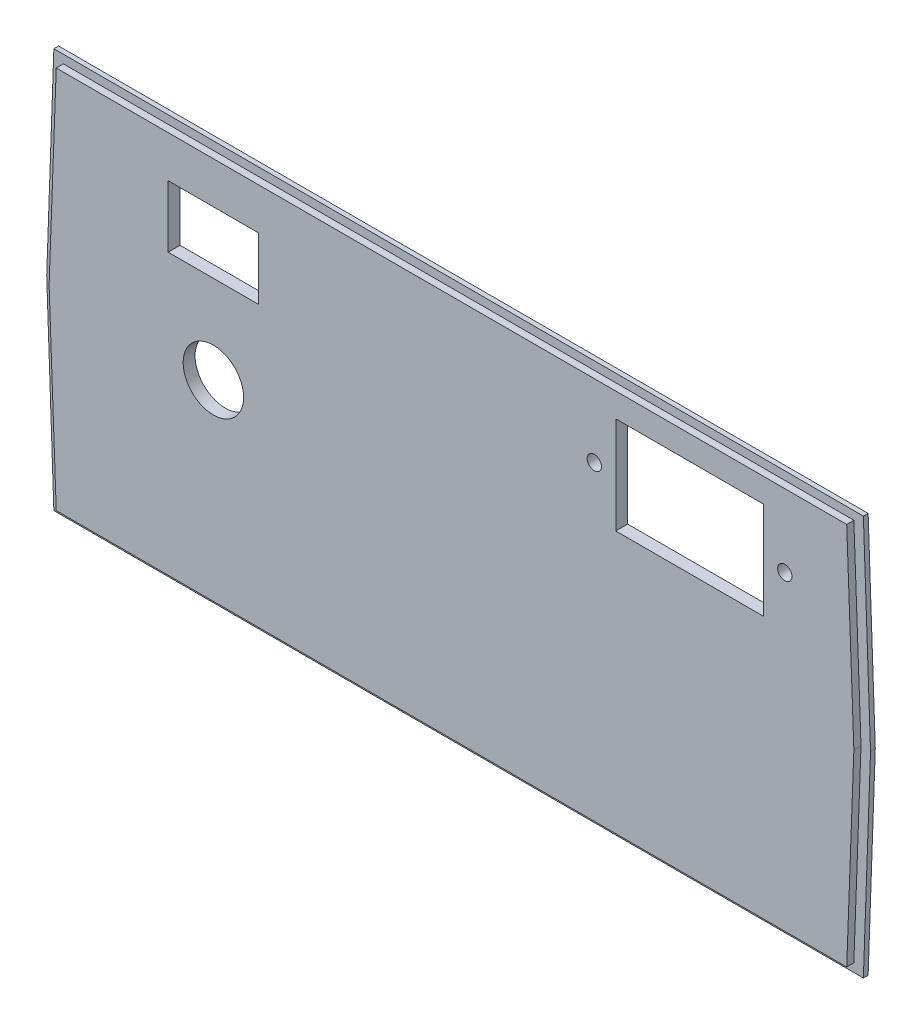
ISO-10303-21;
HEADER;
FILE_DESCRIPTION(('STEP AP214'),'2;1');
FILE_NAME('part.step','',(''),(''),'','','');
FILE_SCHEMA(('AUTOMOTIVE_DESIGN { 1 0 10303 214 1 1 1 1 }'));
ENDSEC;
DATA;
#1=APPLICATION_CONTEXT('core data for automotive mechanical design processes');
#2=APPLICATION_PROTOCOL_DEFINITION('international standard','automotive_design',2000,#1);
#3=PRODUCT_CONTEXT('',#1,'mechanical');
#4=PRODUCT('Part','Part','',(#3));
#5=PRODUCT_RELATED_PRODUCT_CATEGORY('part','',(#4));
#6=PRODUCT_DEFINITION_FORMATION('','',#4);
#7=PRODUCT_DEFINITION_CONTEXT('part definition',#1,'design');
#8=PRODUCT_DEFINITION('design','',#6,#7);
#9=PRODUCT_DEFINITION_SHAPE('','',#8);
#10=(LENGTH_UNIT() NAMED_UNIT(*) SI_UNIT(.MILLI.,.METRE.));
#11=(NAMED_UNIT(*) PLANE_ANGLE_UNIT() SI_UNIT($,.RADIAN.));
#12=(NAMED_UNIT(*) SI_UNIT($,.STERADIAN.) SOLID_ANGLE_UNIT());
#13=UNCERTAINTY_MEASURE_WITH_UNIT(LENGTH_MEASURE(1.E-05),#10,'distance_accuracy_value','');
#14=(GEOMETRIC_REPRESENTATION_CONTEXT(3) GLOBAL_UNCERTAINTY_ASSIGNED_CONTEXT((#13)) GLOBAL_UNIT_ASSIGNED_CONTEXT((#10,
#11,#12)) REPRESENTATION_CONTEXT('',''));
#15=CARTESIAN_POINT('',(0.,0.,0.));
#16=DIRECTION('',(0.,0.,1.));
#17=DIRECTION('',(1.,0.,0.));
#18=AXIS2_PLACEMENT_3D('',#15,#16,#17);
#19=CARTESIAN_POINT('',(0.,0.,1.));
#20=DIRECTION('',(0.,0.,-1.));
#21=DIRECTION('',(-1.,0.,0.));
#22=AXIS2_PLACEMENT_3D('',#19,#20,#21);
#23=PLANE('',#22);
#24=DIRECTION('',(0.0356915305124112,0.99936285434755,0.));
#25=VECTOR('',#24,1.);
#26=CARTESIAN_POINT('',(85.,-42.,1.));
#27=LINE('',#26,#25);
#28=CARTESIAN_POINT('',(85.,-42.,1.));
#29=VERTEX_POINT('',#28);
#30=CARTESIAN_POINT('',(86.5,0.,1.));
#31=VERTEX_POINT('',#30);
#32=EDGE_CURVE('E304',#29,#31,#27,.T.);
#33=ORIENTED_EDGE('',*,*,#32,.T.);
#34=DIRECTION('',(-0.0356915305124112,0.99936285434755,0.));
#35=VECTOR('',#34,1.);
#36=CARTESIAN_POINT('',(85.,42.,1.));
#37=LINE('',#36,#35);
#38=CARTESIAN_POINT('',(85.,42.,1.));
#39=VERTEX_POINT('',#38);
#40=EDGE_CURVE('E307',#31,#39,#37,.T.);
#41=ORIENTED_EDGE('',*,*,#40,.T.);
#42=DIRECTION('',(-1.,0.,0.));
#43=VECTOR('',#42,1.);
#44=CARTESIAN_POINT('',(-85.,42.,1.));
#45=LINE('',#44,#43);
#46=CARTESIAN_POINT('',(-85.,42.,1.));
#47=VERTEX_POINT('',#46);
#48=EDGE_CURVE('E310',#39,#47,#45,.T.);
#49=ORIENTED_EDGE('',*,*,#48,.T.);
#50=DIRECTION('',(-0.0356915305124132,-0.999362854347549,0.));
#51=VECTOR('',#50,1.);
#52=CARTESIAN_POINT('',(-85.,42.,1.));
#53=LINE('',#52,#51);
#54=CARTESIAN_POINT('',(-86.5,0.,1.));
#55=VERTEX_POINT('',#54);
#56=EDGE_CURVE('E312',#47,#55,#53,.T.);
#57=ORIENTED_EDGE('',*,*,#56,.T.);
#58=DIRECTION('',(0.0356915305124132,-0.99936285434755,0.));
#59=VECTOR('',#58,1.);
#60=CARTESIAN_POINT('',(-86.5,0.,1.));
#61=LINE('',#60,#59);
#62=CARTESIAN_POINT('',(-85.,-42.,1.));
#63=VERTEX_POINT('',#62);
#64=EDGE_CURVE('E314',#55,#63,#61,.T.);
#65=ORIENTED_EDGE('',*,*,#64,.T.);
#66=DIRECTION('',(1.,0.,0.));
#67=VECTOR('',#66,1.);
#68=CARTESIAN_POINT('',(-85.,-42.,1.));
#69=LINE('',#68,#67);
#70=EDGE_CURVE('E316',#63,#29,#69,.T.);
#71=ORIENTED_EDGE('',*,*,#70,.T.);
#72=EDGE_LOOP('',(#33,#41,#49,#57,#65,#71));
#73=FACE_BOUND('',#72,.T.);
#74=DIRECTION('',(0.0372412287515797,0.999306304834045,0.));
#75=VECTOR('',#74,1.);
#76=CARTESIAN_POINT('',(83.,-40.25,1.));
#77=LINE('',#76,#75);
#78=CARTESIAN_POINT('',(83.,-40.25,1.));
#79=VERTEX_POINT('',#78);
#80=CARTESIAN_POINT('',(84.5,0.,1.));
#81=VERTEX_POINT('',#80);
#82=EDGE_CURVE('E254',#79,#81,#77,.T.);
#83=ORIENTED_EDGE('',*,*,#82,.F.);
#84=DIRECTION('',(1.,0.,0.));
#85=VECTOR('',#84,1.);
#86=CARTESIAN_POINT('',(-83.,-40.25,1.));
#87=LINE('',#86,#85);
#88=CARTESIAN_POINT('',(-83.,-40.25,1.));
#89=VERTEX_POINT('',#88);
#90=EDGE_CURVE('E259',#89,#79,#87,.T.);
#91=ORIENTED_EDGE('',*,*,#90,.F.);
#92=DIRECTION('',(0.037241228751579,-0.999306304834044,0.));
#93=VECTOR('',#92,1.);
#94=CARTESIAN_POINT('',(-83.,-40.25,1.));
#95=LINE('',#94,#93);
#96=CARTESIAN_POINT('',(-84.5,0.,1.));
#97=VERTEX_POINT('',#96);
#98=EDGE_CURVE('E281',#97,#89,#95,.T.);
#99=ORIENTED_EDGE('',*,*,#98,.F.);
#100=DIRECTION('',(-0.037241228751579,-0.999306304834044,0.));
#101=VECTOR('',#100,1.);
#102=CARTESIAN_POINT('',(-84.5,0.,1.));
#103=LINE('',#102,#101);
#104=CARTESIAN_POINT('',(-83.,40.25,1.));
#105=VERTEX_POINT('',#104);
#106=EDGE_CURVE('E278',#105,#97,#103,.T.);
#107=ORIENTED_EDGE('',*,*,#106,.F.);
#108=DIRECTION('',(-1.,0.,0.));
#109=VECTOR('',#108,1.);
#110=CARTESIAN_POINT('',(-83.,40.25,1.));
#111=LINE('',#110,#109);
#112=CARTESIAN_POINT('',(83.,40.25,1.));
#113=VERTEX_POINT('',#112);
#114=EDGE_CURVE('E275',#113,#105,#111,.T.);
#115=ORIENTED_EDGE('',*,*,#114,.F.);
#116=DIRECTION('',(-0.0372412287515797,0.999306304834045,0.));
#117=VECTOR('',#116,1.);
#118=CARTESIAN_POINT('',(84.5,0.,1.));
#119=LINE('',#118,#117);
#120=EDGE_CURVE('E272',#81,#113,#119,.T.);
#121=ORIENTED_EDGE('',*,*,#120,.F.);
#122=EDGE_LOOP('',(#83,#91,#99,#107,#115,#121));
#123=FACE_BOUND('',#122,.T.);
#124=ADVANCED_FACE('F32',(#73,#123),#23,.F.);
#125=CARTESIAN_POINT('',(85.,-42.,1.));
#126=DIRECTION('',(-0.99936285434755,0.0356915305124112,0.));
#127=DIRECTION('',(-0.0356915305124112,-0.99936285434755,0.));
#128=AXIS2_PLACEMENT_3D('',#125,#126,#127);
#129=PLANE('',#128);
#130=DIRECTION('',(0.0356915305124112,0.99936285434755,0.));
#131=VECTOR('',#130,1.);
#132=CARTESIAN_POINT('',(85.,-42.,0.));
#133=LINE('',#132,#131);
#134=CARTESIAN_POINT('',(85.,-42.,0.));
#135=VERTEX_POINT('',#134);
#136=CARTESIAN_POINT('',(86.5,0.,0.));
#137=VERTEX_POINT('',#136);
#138=EDGE_CURVE('E303',#135,#137,#133,.T.);
#139=ORIENTED_EDGE('',*,*,#138,.T.);
#140=DIRECTION('',(0.,0.,-1.));
#141=VECTOR('',#140,1.);
#142=CARTESIAN_POINT('',(86.5,0.,1.));
#143=LINE('',#142,#141);
#144=EDGE_CURVE('E11',#31,#137,#143,.T.);
#145=ORIENTED_EDGE('',*,*,#144,.F.);
#146=ORIENTED_EDGE('',*,*,#32,.F.);
#147=DIRECTION('',(0.,0.,-1.));
#148=VECTOR('',#147,1.);
#149=CARTESIAN_POINT('',(85.,-42.,1.));
#150=LINE('',#149,#148);
#151=EDGE_CURVE('E318',#29,#135,#150,.T.);
#152=ORIENTED_EDGE('',*,*,#151,.T.);
#153=EDGE_LOOP('',(#139,#145,#146,#152));
#154=FACE_BOUND('',#153,.T.);
#155=ADVANCED_FACE('F34',(#154),#129,.F.);
#156=CARTESIAN_POINT('',(85.,42.,1.));
#157=DIRECTION('',(-0.99936285434755,-0.0356915305124112,0.));
#158=DIRECTION('',(0.0356915305124112,-0.99936285434755,0.));
#159=AXIS2_PLACEMENT_3D('',#156,#157,#158);
#160=PLANE('',#159);
#161=DIRECTION('',(-0.0356915305124112,0.99936285434755,0.));
#162=VECTOR('',#161,1.);
#163=CARTESIAN_POINT('',(85.,42.,0.));
#164=LINE('',#163,#162);
#165=CARTESIAN_POINT('',(85.,42.,0.));
#166=VERTEX_POINT('',#165);
#167=EDGE_CURVE('E321',#137,#166,#164,.T.);
#168=ORIENTED_EDGE('',*,*,#167,.T.);
#169=DIRECTION('',(0.,0.,-1.));
#170=VECTOR('',#169,1.);
#171=CARTESIAN_POINT('',(85.,42.,1.));
#172=LINE('',#171,#170);
#173=EDGE_CURVE('E40',#39,#166,#172,.T.);
#174=ORIENTED_EDGE('',*,*,#173,.F.);
#175=ORIENTED_EDGE('',*,*,#40,.F.);
#176=ORIENTED_EDGE('',*,*,#144,.T.);
#177=EDGE_LOOP('',(#168,#174,#175,#176));
#178=FACE_BOUND('',#177,.T.);
#179=ADVANCED_FACE('F368',(#178),#160,.F.);
#180=CARTESIAN_POINT('',(-85.,42.,1.));
#181=DIRECTION('',(0.,-1.,0.));
#182=DIRECTION('',(0.,0.,-1.));
#183=AXIS2_PLACEMENT_3D('',#180,#181,#182);
#184=PLANE('',#183);
#185=DIRECTION('',(-1.,0.,0.));
#186=VECTOR('',#185,1.);
#187=CARTESIAN_POINT('',(-85.,42.,0.));
#188=LINE('',#187,#186);
#189=CARTESIAN_POINT('',(-85.,42.,0.));
#190=VERTEX_POINT('',#189);
#191=EDGE_CURVE('E323',#166,#190,#188,.T.);
#192=ORIENTED_EDGE('',*,*,#191,.T.);
#193=DIRECTION('',(0.,0.,-1.));
#194=VECTOR('',#193,1.);
#195=CARTESIAN_POINT('',(-85.,42.,1.));
#196=LINE('',#195,#194);
#197=EDGE_CURVE('E338',#47,#190,#196,.T.);
#198=ORIENTED_EDGE('',*,*,#197,.F.);
#199=ORIENTED_EDGE('',*,*,#48,.F.);
#200=ORIENTED_EDGE('',*,*,#173,.T.);
#201=EDGE_LOOP('',(#192,#198,#199,#200));
#202=FACE_BOUND('',#201,.T.);
#203=ADVANCED_FACE('F345',(#202),#184,.F.);
#204=CARTESIAN_POINT('',(-85.,42.,1.));
#205=DIRECTION('',(0.999362854347549,-0.0356915305124132,0.));
#206=DIRECTION('',(0.0356915305124132,0.99936285434755,0.));
#207=AXIS2_PLACEMENT_3D('',#204,#205,#206);
#208=PLANE('',#207);
#209=DIRECTION('',(-0.0356915305124132,-0.999362854347549,0.));
#210=VECTOR('',#209,1.);
#211=CARTESIAN_POINT('',(-85.,42.,0.));
#212=LINE('',#211,#210);
#213=CARTESIAN_POINT('',(-86.5,0.,0.));
#214=VERTEX_POINT('',#213);
#215=EDGE_CURVE('E325',#190,#214,#212,.T.);
#216=ORIENTED_EDGE('',*,*,#215,.T.);
#217=DIRECTION('',(0.,0.,-1.));
#218=VECTOR('',#217,1.);
#219=CARTESIAN_POINT('',(-86.5,0.,1.));
#220=LINE('',#219,#218);
#221=EDGE_CURVE('E335',#55,#214,#220,.T.);
#222=ORIENTED_EDGE('',*,*,#221,.F.);
#223=ORIENTED_EDGE('',*,*,#56,.F.);
#224=ORIENTED_EDGE('',*,*,#197,.T.);
#225=EDGE_LOOP('',(#216,#222,#223,#224));
#226=FACE_BOUND('',#225,.T.);
#227=ADVANCED_FACE('F356',(#226),#208,.F.);
#228=CARTESIAN_POINT('',(-86.5,0.,1.));
#229=DIRECTION('',(0.999362854347549,0.0356915305124132,0.));
#230=DIRECTION('',(-0.0356915305124132,0.99936285434755,0.));
#231=AXIS2_PLACEMENT_3D('',#228,#229,#230);
#232=PLANE('',#231);
#233=DIRECTION('',(0.0356915305124132,-0.99936285434755,0.));
#234=VECTOR('',#233,1.);
#235=CARTESIAN_POINT('',(-86.5,0.,0.));
#236=LINE('',#235,#234);
#237=CARTESIAN_POINT('',(-85.,-42.,0.));
#238=VERTEX_POINT('',#237);
#239=EDGE_CURVE('E327',#214,#238,#236,.T.);
#240=ORIENTED_EDGE('',*,*,#239,.T.);
#241=DIRECTION('',(0.,0.,-1.));
#242=VECTOR('',#241,1.);
#243=CARTESIAN_POINT('',(-85.,-42.,1.));
#244=LINE('',#243,#242);
#245=EDGE_CURVE('E332',#63,#238,#244,.T.);
#246=ORIENTED_EDGE('',*,*,#245,.F.);
#247=ORIENTED_EDGE('',*,*,#64,.F.);
#248=ORIENTED_EDGE('',*,*,#221,.T.);
#249=EDGE_LOOP('',(#240,#246,#247,#248));
#250=FACE_BOUND('',#249,.T.);
#251=ADVANCED_FACE('F360',(#250),#232,.F.);
#252=CARTESIAN_POINT('',(-85.,-42.,1.));
#253=DIRECTION('',(0.,1.,0.));
#254=DIRECTION('',(0.,0.,1.));
#255=AXIS2_PLACEMENT_3D('',#252,#253,#254);
#256=PLANE('',#255);
#257=DIRECTION('',(1.,0.,0.));
#258=VECTOR('',#257,1.);
#259=CARTESIAN_POINT('',(-85.,-42.,0.));
#260=LINE('',#259,#258);
#261=EDGE_CURVE('E308',#238,#135,#260,.T.);
#262=ORIENTED_EDGE('',*,*,#261,.T.);
#263=ORIENTED_EDGE('',*,*,#151,.F.);
#264=ORIENTED_EDGE('',*,*,#70,.F.);
#265=ORIENTED_EDGE('',*,*,#245,.T.);
#266=EDGE_LOOP('',(#262,#263,#264,#265));
#267=FACE_BOUND('',#266,.T.);
#268=ADVANCED_FACE('F371',(#267),#256,.F.);
#269=CARTESIAN_POINT('',(0.,0.,0.));
#270=DIRECTION('',(0.,0.,-1.));
#271=DIRECTION('',(-1.,0.,0.));
#272=AXIS2_PLACEMENT_3D('',#269,#270,#271);
#273=PLANE('',#272);
#274=DIRECTION('',(0.,1.,0.));
#275=VECTOR('',#274,1.);
#276=CARTESIAN_POINT('',(-59.5,31.5,0.));
#277=LINE('',#276,#275);
#278=CARTESIAN_POINT('',(-59.5,18.5,0.));
#279=VERTEX_POINT('',#278);
#280=CARTESIAN_POINT('',(-59.5,31.5,0.));
#281=VERTEX_POINT('',#280);
#282=EDGE_CURVE('E47',#279,#281,#277,.T.);
#283=ORIENTED_EDGE('',*,*,#282,.F.);
#284=DIRECTION('',(-1.,0.,0.));
#285=VECTOR('',#284,1.);
#286=CARTESIAN_POINT('',(-40.5,18.5,0.));
#287=LINE('',#286,#285);
#288=CARTESIAN_POINT('',(-40.5,18.5,0.));
#289=VERTEX_POINT('',#288);
#290=EDGE_CURVE('E177',#289,#279,#287,.T.);
#291=ORIENTED_EDGE('',*,*,#290,.F.);
#292=DIRECTION('',(0.,-1.,0.));
#293=VECTOR('',#292,1.);
#294=CARTESIAN_POINT('',(-40.5,31.5,0.));
#295=LINE('',#294,#293);
#296=CARTESIAN_POINT('',(-40.5,31.5,0.));
#297=VERTEX_POINT('',#296);
#298=EDGE_CURVE('E197',#297,#289,#295,.T.);
#299=ORIENTED_EDGE('',*,*,#298,.F.);
#300=DIRECTION('',(1.,0.,0.));
#301=VECTOR('',#300,1.);
#302=CARTESIAN_POINT('',(-40.5,31.5,0.));
#303=LINE('',#302,#301);
#304=EDGE_CURVE('E191',#281,#297,#303,.T.);
#305=ORIENTED_EDGE('',*,*,#304,.F.);
#306=EDGE_LOOP('',(#283,#291,#299,#305));
#307=FACE_BOUND('',#306,.T.);
#308=CARTESIAN_POINT('',(-50.,0.,0.));
#309=DIRECTION('',(0.,0.,-1.));
#310=DIRECTION('',(-1.,0.,0.));
#311=AXIS2_PLACEMENT_3D('',#308,#309,#310);
#312=CIRCLE('',#311,6.35);
#313=CARTESIAN_POINT('',(-56.35,0.,0.));
#314=VERTEX_POINT('',#313);
#315=EDGE_CURVE('E183',#314,#314,#312,.T.);
#316=ORIENTED_EDGE('',*,*,#315,.F.);
#317=EDGE_LOOP('',(#316));
#318=FACE_BOUND('',#317,.T.);
#319=CARTESIAN_POINT('',(30.,25.,0.));
#320=DIRECTION('',(0.,0.,-1.));
#321=DIRECTION('',(1.,0.,0.));
#322=AXIS2_PLACEMENT_3D('',#319,#320,#321);
#323=CIRCLE('',#322,1.5);
#324=CARTESIAN_POINT('',(31.5,25.,0.));
#325=VERTEX_POINT('',#324);
#326=EDGE_CURVE('E211',#325,#325,#323,.T.);
#327=ORIENTED_EDGE('',*,*,#326,.F.);
#328=EDGE_LOOP('',(#327));
#329=FACE_BOUND('',#328,.T.);
#330=CARTESIAN_POINT('',(70.,25.,0.));
#331=DIRECTION('',(0.,0.,-1.));
#332=DIRECTION('',(-1.,0.,0.));
#333=AXIS2_PLACEMENT_3D('',#330,#331,#332);
#334=CIRCLE('',#333,1.5);
#335=CARTESIAN_POINT('',(68.5,25.,0.));
#336=VERTEX_POINT('',#335);
#337=EDGE_CURVE('E217',#336,#336,#334,.T.);
#338=ORIENTED_EDGE('',*,*,#337,.F.);
#339=EDGE_LOOP('',(#338));
#340=FACE_BOUND('',#339,.T.);
#341=DIRECTION('',(0.,1.,0.));
#342=VECTOR('',#341,1.);
#343=CARTESIAN_POINT('',(34.5,35.2,0.));
#344=LINE('',#343,#342);
#345=CARTESIAN_POINT('',(34.5,14.8,0.));
#346=VERTEX_POINT('',#345);
#347=CARTESIAN_POINT('',(34.5,35.2,0.));
#348=VERTEX_POINT('',#347);
#349=EDGE_CURVE('E231',#346,#348,#344,.T.);
#350=ORIENTED_EDGE('',*,*,#349,.F.);
#351=DIRECTION('',(-1.,0.,0.));
#352=VECTOR('',#351,1.);
#353=CARTESIAN_POINT('',(65.5,14.8,0.));
#354=LINE('',#353,#352);
#355=CARTESIAN_POINT('',(65.5,14.8,0.));
#356=VERTEX_POINT('',#355);
#357=EDGE_CURVE('E239',#356,#346,#354,.T.);
#358=ORIENTED_EDGE('',*,*,#357,.F.);
#359=DIRECTION('',(0.,-1.,0.));
#360=VECTOR('',#359,1.);
#361=CARTESIAN_POINT('',(65.5,35.2,0.));
#362=LINE('',#361,#360);
#363=CARTESIAN_POINT('',(65.5,35.2,0.));
#364=VERTEX_POINT('',#363);
#365=EDGE_CURVE('E236',#364,#356,#362,.T.);
#366=ORIENTED_EDGE('',*,*,#365,.F.);
#367=DIRECTION('',(1.,0.,0.));
#368=VECTOR('',#367,1.);
#369=CARTESIAN_POINT('',(65.5,35.2,0.));
#370=LINE('',#369,#368);
#371=EDGE_CURVE('E233',#348,#364,#370,.T.);
#372=ORIENTED_EDGE('',*,*,#371,.F.);
#373=EDGE_LOOP('',(#350,#358,#366,#372));
#374=FACE_BOUND('',#373,.T.);
#375=ORIENTED_EDGE('',*,*,#138,.F.);
#376=ORIENTED_EDGE('',*,*,#261,.F.);
#377=ORIENTED_EDGE('',*,*,#239,.F.);
#378=ORIENTED_EDGE('',*,*,#215,.F.);
#379=ORIENTED_EDGE('',*,*,#191,.F.);
#380=ORIENTED_EDGE('',*,*,#167,.F.);
#381=EDGE_LOOP('',(#375,#376,#377,#378,#379,#380));
#382=FACE_BOUND('',#381,.T.);
#383=ADVANCED_FACE('F351',(#307,#318,#329,#340,#374,#382),#273,.T.);
#384=CARTESIAN_POINT('',(83.,-40.25,2.5));
#385=DIRECTION('',(-0.999306304834044,0.0372412287515797,0.));
#386=DIRECTION('',(-0.0372412287515797,-0.999306304834045,0.));
#387=AXIS2_PLACEMENT_3D('',#384,#385,#386);
#388=PLANE('',#387);
#389=ORIENTED_EDGE('',*,*,#82,.T.);
#390=DIRECTION('',(0.,0.,-1.));
#391=VECTOR('',#390,1.);
#392=CARTESIAN_POINT('',(84.5,0.,2.5));
#393=LINE('',#392,#391);
#394=CARTESIAN_POINT('',(84.5,0.,2.5));
#395=VERTEX_POINT('',#394);
#396=EDGE_CURVE('E300',#395,#81,#393,.T.);
#397=ORIENTED_EDGE('',*,*,#396,.F.);
#398=DIRECTION('',(0.0372412287515797,0.999306304834045,0.));
#399=VECTOR('',#398,1.);
#400=CARTESIAN_POINT('',(83.,-40.25,2.5));
#401=LINE('',#400,#399);
#402=CARTESIAN_POINT('',(83.,-40.25,2.5));
#403=VERTEX_POINT('',#402);
#404=EDGE_CURVE('E255',#403,#395,#401,.T.);
#405=ORIENTED_EDGE('',*,*,#404,.F.);
#406=DIRECTION('',(0.,0.,-1.));
#407=VECTOR('',#406,1.);
#408=CARTESIAN_POINT('',(83.,-40.25,2.5));
#409=LINE('',#408,#407);
#410=EDGE_CURVE('E269',#403,#79,#409,.T.);
#411=ORIENTED_EDGE('',*,*,#410,.T.);
#412=EDGE_LOOP('',(#389,#397,#405,#411));
#413=FACE_BOUND('',#412,.T.);
#414=ADVANCED_FACE('F379',(#413),#388,.F.);
#415=CARTESIAN_POINT('',(84.5,0.,2.5));
#416=DIRECTION('',(-0.999306304834044,-0.0372412287515797,0.));
#417=DIRECTION('',(0.0372412287515797,-0.999306304834045,0.));
#418=AXIS2_PLACEMENT_3D('',#415,#416,#417);
#419=PLANE('',#418);
#420=ORIENTED_EDGE('',*,*,#120,.T.);
#421=DIRECTION('',(0.,0.,-1.));
#422=VECTOR('',#421,1.);
#423=CARTESIAN_POINT('',(83.,40.25,2.5));
#424=LINE('',#423,#422);
#425=CARTESIAN_POINT('',(83.,40.25,2.5));
#426=VERTEX_POINT('',#425);
#427=EDGE_CURVE('E297',#426,#113,#424,.T.);
#428=ORIENTED_EDGE('',*,*,#427,.F.);
#429=DIRECTION('',(-0.0372412287515797,0.999306304834045,0.));
#430=VECTOR('',#429,1.);
#431=CARTESIAN_POINT('',(84.5,0.,2.5));
#432=LINE('',#431,#430);
#433=EDGE_CURVE('E258',#395,#426,#432,.T.);
#434=ORIENTED_EDGE('',*,*,#433,.F.);
#435=ORIENTED_EDGE('',*,*,#396,.T.);
#436=EDGE_LOOP('',(#420,#428,#434,#435));
#437=FACE_BOUND('',#436,.T.);
#438=ADVANCED_FACE('F391',(#437),#419,.F.);
#439=CARTESIAN_POINT('',(-83.,40.25,2.5));
#440=DIRECTION('',(0.,-1.,0.));
#441=DIRECTION('',(0.,0.,-1.));
#442=AXIS2_PLACEMENT_3D('',#439,#440,#441);
#443=PLANE('',#442);
#444=ORIENTED_EDGE('',*,*,#114,.T.);
#445=DIRECTION('',(0.,0.,-1.));
#446=VECTOR('',#445,1.);
#447=CARTESIAN_POINT('',(-83.,40.25,2.5));
#448=LINE('',#447,#446);
#449=CARTESIAN_POINT('',(-83.,40.25,2.5));
#450=VERTEX_POINT('',#449);
#451=EDGE_CURVE('E294',#450,#105,#448,.T.);
#452=ORIENTED_EDGE('',*,*,#451,.F.);
#453=DIRECTION('',(-1.,0.,0.));
#454=VECTOR('',#453,1.);
#455=CARTESIAN_POINT('',(-83.,40.25,2.5));
#456=LINE('',#455,#454);
#457=EDGE_CURVE('E261',#426,#450,#456,.T.);
#458=ORIENTED_EDGE('',*,*,#457,.F.);
#459=ORIENTED_EDGE('',*,*,#427,.T.);
#460=EDGE_LOOP('',(#444,#452,#458,#459));
#461=FACE_BOUND('',#460,.T.);
#462=ADVANCED_FACE('F395',(#461),#443,.F.);
#463=CARTESIAN_POINT('',(-84.5,0.,2.5));
#464=DIRECTION('',(0.999306304834045,-0.037241228751579,0.));
#465=DIRECTION('',(0.037241228751579,0.999306304834045,0.));
#466=AXIS2_PLACEMENT_3D('',#463,#464,#465);
#467=PLANE('',#466);
#468=ORIENTED_EDGE('',*,*,#106,.T.);
#469=DIRECTION('',(0.,0.,-1.));
#470=VECTOR('',#469,1.);
#471=CARTESIAN_POINT('',(-84.5,0.,2.5));
#472=LINE('',#471,#470);
#473=CARTESIAN_POINT('',(-84.5,0.,2.5));
#474=VERTEX_POINT('',#473);
#475=EDGE_CURVE('E291',#474,#97,#472,.T.);
#476=ORIENTED_EDGE('',*,*,#475,.F.);
#477=DIRECTION('',(-0.037241228751579,-0.999306304834044,0.));
#478=VECTOR('',#477,1.);
#479=CARTESIAN_POINT('',(-84.5,0.,2.5));
#480=LINE('',#479,#478);
#481=EDGE_CURVE('E263',#450,#474,#480,.T.);
#482=ORIENTED_EDGE('',*,*,#481,.F.);
#483=ORIENTED_EDGE('',*,*,#451,.T.);
#484=EDGE_LOOP('',(#468,#476,#482,#483));
#485=FACE_BOUND('',#484,.T.);
#486=ADVANCED_FACE('F399',(#485),#467,.F.);
#487=CARTESIAN_POINT('',(-83.,-40.25,2.5));
#488=DIRECTION('',(0.999306304834045,0.037241228751579,0.));
#489=DIRECTION('',(-0.037241228751579,0.999306304834045,0.));
#490=AXIS2_PLACEMENT_3D('',#487,#488,#489);
#491=PLANE('',#490);
#492=ORIENTED_EDGE('',*,*,#98,.T.);
#493=DIRECTION('',(0.,0.,-1.));
#494=VECTOR('',#493,1.);
#495=CARTESIAN_POINT('',(-83.,-40.25,2.5));
#496=LINE('',#495,#494);
#497=CARTESIAN_POINT('',(-83.,-40.25,2.5));
#498=VERTEX_POINT('',#497);
#499=EDGE_CURVE('E288',#498,#89,#496,.T.);
#500=ORIENTED_EDGE('',*,*,#499,.F.);
#501=DIRECTION('',(0.037241228751579,-0.999306304834044,0.));
#502=VECTOR('',#501,1.);
#503=CARTESIAN_POINT('',(-83.,-40.25,2.5));
#504=LINE('',#503,#502);
#505=EDGE_CURVE('E265',#474,#498,#504,.T.);
#506=ORIENTED_EDGE('',*,*,#505,.F.);
#507=ORIENTED_EDGE('',*,*,#475,.T.);
#508=EDGE_LOOP('',(#492,#500,#506,#507));
#509=FACE_BOUND('',#508,.T.);
#510=ADVANCED_FACE('F403',(#509),#491,.F.);
#511=CARTESIAN_POINT('',(-83.,-40.25,2.5));
#512=DIRECTION('',(0.,1.,0.));
#513=DIRECTION('',(0.,0.,1.));
#514=AXIS2_PLACEMENT_3D('',#511,#512,#513);
#515=PLANE('',#514);
#516=ORIENTED_EDGE('',*,*,#90,.T.);
#517=ORIENTED_EDGE('',*,*,#410,.F.);
#518=DIRECTION('',(1.,0.,0.));
#519=VECTOR('',#518,1.);
#520=CARTESIAN_POINT('',(-83.,-40.25,2.5));
#521=LINE('',#520,#519);
#522=EDGE_CURVE('E267',#498,#403,#521,.T.);
#523=ORIENTED_EDGE('',*,*,#522,.F.);
#524=ORIENTED_EDGE('',*,*,#499,.T.);
#525=EDGE_LOOP('',(#516,#517,#523,#524));
#526=FACE_BOUND('',#525,.T.);
#527=ADVANCED_FACE('F407',(#526),#515,.F.);
#528=CARTESIAN_POINT('',(0.,0.,2.5));
#529=DIRECTION('',(0.,0.,-1.));
#530=DIRECTION('',(-1.,0.,0.));
#531=AXIS2_PLACEMENT_3D('',#528,#529,#530);
#532=PLANE('',#531);
#533=DIRECTION('',(1.,0.,0.));
#534=VECTOR('',#533,1.);
#535=CARTESIAN_POINT('',(-40.5,18.5,2.5));
#536=LINE('',#535,#534);
#537=CARTESIAN_POINT('',(-59.5,18.5,2.5));
#538=VERTEX_POINT('',#537);
#539=CARTESIAN_POINT('',(-40.5,18.5,2.5));
#540=VERTEX_POINT('',#539);
#541=EDGE_CURVE('E189',#538,#540,#536,.T.);
#542=ORIENTED_EDGE('',*,*,#541,.F.);
#543=DIRECTION('',(0.,-1.,0.));
#544=VECTOR('',#543,1.);
#545=CARTESIAN_POINT('',(-59.5,31.5,2.5));
#546=LINE('',#545,#544);
#547=CARTESIAN_POINT('',(-59.5,31.5,2.5));
#548=VERTEX_POINT('',#547);
#549=EDGE_CURVE('E171',#548,#538,#546,.T.);
#550=ORIENTED_EDGE('',*,*,#549,.F.);
#551=DIRECTION('',(-1.,0.,0.));
#552=VECTOR('',#551,1.);
#553=CARTESIAN_POINT('',(-40.5,31.5,2.5));
#554=LINE('',#553,#552);
#555=CARTESIAN_POINT('',(-40.5,31.5,2.5));
#556=VERTEX_POINT('',#555);
#557=EDGE_CURVE('E180',#556,#548,#554,.T.);
#558=ORIENTED_EDGE('',*,*,#557,.F.);
#559=DIRECTION('',(0.,1.,0.));
#560=VECTOR('',#559,1.);
#561=CARTESIAN_POINT('',(-40.5,31.5,2.5));
#562=LINE('',#561,#560);
#563=EDGE_CURVE('E55',#540,#556,#562,.T.);
#564=ORIENTED_EDGE('',*,*,#563,.F.);
#565=EDGE_LOOP('',(#542,#550,#558,#564));
#566=FACE_BOUND('',#565,.T.);
#567=CARTESIAN_POINT('',(-50.,0.,2.5));
#568=DIRECTION('',(0.,0.,-1.));
#569=DIRECTION('',(-1.,0.,0.));
#570=AXIS2_PLACEMENT_3D('',#567,#568,#569);
#571=CIRCLE('',#570,6.35);
#572=CARTESIAN_POINT('',(-56.35,0.,2.5));
#573=VERTEX_POINT('',#572);
#574=EDGE_CURVE('E208',#573,#573,#571,.F.);
#575=ORIENTED_EDGE('',*,*,#574,.F.);
#576=EDGE_LOOP('',(#575));
#577=FACE_BOUND('',#576,.T.);
#578=CARTESIAN_POINT('',(30.,25.,2.5));
#579=DIRECTION('',(0.,0.,-1.));
#580=DIRECTION('',(-1.,0.,0.));
#581=AXIS2_PLACEMENT_3D('',#578,#579,#580);
#582=CIRCLE('',#581,1.5);
#583=CARTESIAN_POINT('',(28.5,25.,2.5));
#584=VERTEX_POINT('',#583);
#585=EDGE_CURVE('E214',#584,#584,#582,.F.);
#586=ORIENTED_EDGE('',*,*,#585,.F.);
#587=EDGE_LOOP('',(#586));
#588=FACE_BOUND('',#587,.T.);
#589=CARTESIAN_POINT('',(70.,25.,2.5));
#590=DIRECTION('',(0.,0.,-1.));
#591=DIRECTION('',(-1.,0.,0.));
#592=AXIS2_PLACEMENT_3D('',#589,#590,#591);
#593=CIRCLE('',#592,1.5);
#594=CARTESIAN_POINT('',(68.5,25.,2.5));
#595=VERTEX_POINT('',#594);
#596=EDGE_CURVE('E220',#595,#595,#593,.F.);
#597=ORIENTED_EDGE('',*,*,#596,.F.);
#598=EDGE_LOOP('',(#597));
#599=FACE_BOUND('',#598,.T.);
#600=DIRECTION('',(1.,0.,0.));
#601=VECTOR('',#600,1.);
#602=CARTESIAN_POINT('',(65.5,14.8,2.5));
#603=LINE('',#602,#601);
#604=CARTESIAN_POINT('',(34.5,14.8,2.5));
#605=VERTEX_POINT('',#604);
#606=CARTESIAN_POINT('',(65.5,14.8,2.5));
#607=VERTEX_POINT('',#606);
#608=EDGE_CURVE('E225',#605,#607,#603,.T.);
#609=ORIENTED_EDGE('',*,*,#608,.F.);
#610=DIRECTION('',(0.,-1.,0.));
#611=VECTOR('',#610,1.);
#612=CARTESIAN_POINT('',(34.5,35.2,2.5));
#613=LINE('',#612,#611);
#614=CARTESIAN_POINT('',(34.5,35.2,2.5));
#615=VERTEX_POINT('',#614);
#616=EDGE_CURVE('E228',#615,#605,#613,.T.);
#617=ORIENTED_EDGE('',*,*,#616,.F.);
#618=DIRECTION('',(-1.,0.,0.));
#619=VECTOR('',#618,1.);
#620=CARTESIAN_POINT('',(65.5,35.2,2.5));
#621=LINE('',#620,#619);
#622=CARTESIAN_POINT('',(65.5,35.2,2.5));
#623=VERTEX_POINT('',#622);
#624=EDGE_CURVE('E245',#623,#615,#621,.T.);
#625=ORIENTED_EDGE('',*,*,#624,.F.);
#626=DIRECTION('',(0.,1.,0.));
#627=VECTOR('',#626,1.);
#628=CARTESIAN_POINT('',(65.5,35.2,2.5));
#629=LINE('',#628,#627);
#630=EDGE_CURVE('E223',#607,#623,#629,.T.);
#631=ORIENTED_EDGE('',*,*,#630,.F.);
#632=EDGE_LOOP('',(#609,#617,#625,#631));
#633=FACE_BOUND('',#632,.T.);
#634=ORIENTED_EDGE('',*,*,#404,.T.);
#635=ORIENTED_EDGE('',*,*,#433,.T.);
#636=ORIENTED_EDGE('',*,*,#457,.T.);
#637=ORIENTED_EDGE('',*,*,#481,.T.);
#638=ORIENTED_EDGE('',*,*,#505,.T.);
#639=ORIENTED_EDGE('',*,*,#522,.T.);
#640=EDGE_LOOP('',(#634,#635,#636,#637,#638,#639));
#641=FACE_BOUND('',#640,.T.);
#642=ADVANCED_FACE('F186',(#566,#577,#588,#599,#633,#641),#532,.F.);
#643=CARTESIAN_POINT('',(34.5,35.2,2.501));
#644=DIRECTION('',(-1.,0.,0.));
#645=DIRECTION('',(0.,-1.,0.));
#646=AXIS2_PLACEMENT_3D('',#643,#644,#645);
#647=PLANE('',#646);
#648=ORIENTED_EDGE('',*,*,#616,.T.);
#649=DIRECTION('',(0.,0.,-1.));
#650=VECTOR('',#649,1.);
#651=CARTESIAN_POINT('',(34.5,14.8,2.501));
#652=LINE('',#651,#650);
#653=EDGE_CURVE('E243',#605,#346,#652,.T.);
#654=ORIENTED_EDGE('',*,*,#653,.T.);
#655=ORIENTED_EDGE('',*,*,#349,.T.);
#656=DIRECTION('',(0.,0.,-1.));
#657=VECTOR('',#656,1.);
#658=CARTESIAN_POINT('',(34.5,35.2,2.501));
#659=LINE('',#658,#657);
#660=EDGE_CURVE('E242',#615,#348,#659,.T.);
#661=ORIENTED_EDGE('',*,*,#660,.F.);
#662=EDGE_LOOP('',(#648,#654,#655,#661));
#663=FACE_BOUND('',#662,.T.);
#664=ADVANCED_FACE('F414',(#663),#647,.F.);
#665=CARTESIAN_POINT('',(65.5,14.8,2.501));
#666=DIRECTION('',(0.,-1.,0.));
#667=DIRECTION('',(0.,0.,-1.));
#668=AXIS2_PLACEMENT_3D('',#665,#666,#667);
#669=PLANE('',#668);
#670=ORIENTED_EDGE('',*,*,#608,.T.);
#671=DIRECTION('',(0.,0.,-1.));
#672=VECTOR('',#671,1.);
#673=CARTESIAN_POINT('',(65.5,14.8,2.501));
#674=LINE('',#673,#672);
#675=EDGE_CURVE('E246',#607,#356,#674,.T.);
#676=ORIENTED_EDGE('',*,*,#675,.T.);
#677=ORIENTED_EDGE('',*,*,#357,.T.);
#678=ORIENTED_EDGE('',*,*,#653,.F.);
#679=EDGE_LOOP('',(#670,#676,#677,#678));
#680=FACE_BOUND('',#679,.T.);
#681=ADVANCED_FACE('F417',(#680),#669,.F.);
#682=CARTESIAN_POINT('',(65.5,35.2,2.501));
#683=DIRECTION('',(1.,0.,0.));
#684=DIRECTION('',(0.,0.,-1.));
#685=AXIS2_PLACEMENT_3D('',#682,#683,#684);
#686=PLANE('',#685);
#687=ORIENTED_EDGE('',*,*,#630,.T.);
#688=DIRECTION('',(0.,0.,-1.));
#689=VECTOR('',#688,1.);
#690=CARTESIAN_POINT('',(65.5,35.2,2.501));
#691=LINE('',#690,#689);
#692=EDGE_CURVE('E248',#623,#364,#691,.T.);
#693=ORIENTED_EDGE('',*,*,#692,.T.);
#694=ORIENTED_EDGE('',*,*,#365,.T.);
#695=ORIENTED_EDGE('',*,*,#675,.F.);
#696=EDGE_LOOP('',(#687,#693,#694,#695));
#697=FACE_BOUND('',#696,.T.);
#698=ADVANCED_FACE('F423',(#697),#686,.F.);
#699=CARTESIAN_POINT('',(65.5,35.2,2.501));
#700=DIRECTION('',(0.,1.,0.));
#701=DIRECTION('',(0.,0.,1.));
#702=AXIS2_PLACEMENT_3D('',#699,#700,#701);
#703=PLANE('',#702);
#704=ORIENTED_EDGE('',*,*,#624,.T.);
#705=ORIENTED_EDGE('',*,*,#660,.T.);
#706=ORIENTED_EDGE('',*,*,#371,.T.);
#707=ORIENTED_EDGE('',*,*,#692,.F.);
#708=EDGE_LOOP('',(#704,#705,#706,#707));
#709=FACE_BOUND('',#708,.T.);
#710=ADVANCED_FACE('F419',(#709),#703,.F.);
#711=CARTESIAN_POINT('',(70.,25.,2.501));
#712=DIRECTION('',(0.,0.,-1.));
#713=DIRECTION('',(-1.,0.,0.));
#714=AXIS2_PLACEMENT_3D('',#711,#712,#713);
#715=CYLINDRICAL_SURFACE('',#714,1.5);
#716=ORIENTED_EDGE('',*,*,#337,.T.);
#717=EDGE_LOOP('',(#716));
#718=FACE_BOUND('',#717,.T.);
#719=ORIENTED_EDGE('',*,*,#596,.T.);
#720=EDGE_LOOP('',(#719));
#721=FACE_BOUND('',#720,.T.);
#722=ADVANCED_FACE('F422',(#718,#721),#715,.F.);
#723=CARTESIAN_POINT('',(30.,25.,2.501));
#724=DIRECTION('',(0.,0.,-1.));
#725=DIRECTION('',(-1.,0.,0.));
#726=AXIS2_PLACEMENT_3D('',#723,#724,#725);
#727=CYLINDRICAL_SURFACE('',#726,1.5);
#728=ORIENTED_EDGE('',*,*,#326,.T.);
#729=EDGE_LOOP('',(#728));
#730=FACE_BOUND('',#729,.T.);
#731=ORIENTED_EDGE('',*,*,#585,.T.);
#732=EDGE_LOOP('',(#731));
#733=FACE_BOUND('',#732,.T.);
#734=ADVANCED_FACE('F433',(#730,#733),#727,.F.);
#735=CARTESIAN_POINT('',(-50.,0.,2.501));
#736=DIRECTION('',(0.,0.,-1.));
#737=DIRECTION('',(-1.,0.,0.));
#738=AXIS2_PLACEMENT_3D('',#735,#736,#737);
#739=CYLINDRICAL_SURFACE('',#738,6.35);
#740=ORIENTED_EDGE('',*,*,#315,.T.);
#741=EDGE_LOOP('',(#740));
#742=FACE_BOUND('',#741,.T.);
#743=ORIENTED_EDGE('',*,*,#574,.T.);
#744=EDGE_LOOP('',(#743));
#745=FACE_BOUND('',#744,.T.);
#746=ADVANCED_FACE('F437',(#742,#745),#739,.F.);
#747=CARTESIAN_POINT('',(-59.5,31.5,2.501));
#748=DIRECTION('',(-1.,0.,0.));
#749=DIRECTION('',(0.,0.,1.));
#750=AXIS2_PLACEMENT_3D('',#747,#748,#749);
#751=PLANE('',#750);
#752=ORIENTED_EDGE('',*,*,#549,.T.);
#753=DIRECTION('',(0.,0.,-1.));
#754=VECTOR('',#753,1.);
#755=CARTESIAN_POINT('',(-59.5,18.5,2.501));
#756=LINE('',#755,#754);
#757=EDGE_CURVE('E184',#538,#279,#756,.T.);
#758=ORIENTED_EDGE('',*,*,#757,.T.);
#759=ORIENTED_EDGE('',*,*,#282,.T.);
#760=DIRECTION('',(0.,0.,-1.));
#761=VECTOR('',#760,1.);
#762=CARTESIAN_POINT('',(-59.5,31.5,2.501));
#763=LINE('',#762,#761);
#764=EDGE_CURVE('E167',#548,#281,#763,.T.);
#765=ORIENTED_EDGE('',*,*,#764,.F.);
#766=EDGE_LOOP('',(#752,#758,#759,#765));
#767=FACE_BOUND('',#766,.T.);
#768=ADVANCED_FACE('F169',(#767),#751,.F.);
#769=CARTESIAN_POINT('',(-40.5,18.5,2.501));
#770=DIRECTION('',(0.,-1.,0.));
#771=DIRECTION('',(0.,0.,-1.));
#772=AXIS2_PLACEMENT_3D('',#769,#770,#771);
#773=PLANE('',#772);
#774=ORIENTED_EDGE('',*,*,#541,.T.);
#775=DIRECTION('',(0.,0.,-1.));
#776=VECTOR('',#775,1.);
#777=CARTESIAN_POINT('',(-40.5,18.5,2.501));
#778=LINE('',#777,#776);
#779=EDGE_CURVE('E203',#540,#289,#778,.T.);
#780=ORIENTED_EDGE('',*,*,#779,.T.);
#781=ORIENTED_EDGE('',*,*,#290,.T.);
#782=ORIENTED_EDGE('',*,*,#757,.F.);
#783=EDGE_LOOP('',(#774,#780,#781,#782));
#784=FACE_BOUND('',#783,.T.);
#785=ADVANCED_FACE('F444',(#784),#773,.F.);
#786=CARTESIAN_POINT('',(-40.5,31.5,2.501));
#787=DIRECTION('',(1.,0.,0.));
#788=DIRECTION('',(0.,0.,-1.));
#789=AXIS2_PLACEMENT_3D('',#786,#787,#788);
#790=PLANE('',#789);
#791=ORIENTED_EDGE('',*,*,#563,.T.);
#792=DIRECTION('',(0.,0.,-1.));
#793=VECTOR('',#792,1.);
#794=CARTESIAN_POINT('',(-40.5,31.5,2.501));
#795=LINE('',#794,#793);
#796=EDGE_CURVE('E176',#556,#297,#795,.T.);
#797=ORIENTED_EDGE('',*,*,#796,.T.);
#798=ORIENTED_EDGE('',*,*,#298,.T.);
#799=ORIENTED_EDGE('',*,*,#779,.F.);
#800=EDGE_LOOP('',(#791,#797,#798,#799));
#801=FACE_BOUND('',#800,.T.);
#802=ADVANCED_FACE('F447',(#801),#790,.F.);
#803=CARTESIAN_POINT('',(-40.5,31.5,2.501));
#804=DIRECTION('',(0.,1.,0.));
#805=DIRECTION('',(0.,0.,1.));
#806=AXIS2_PLACEMENT_3D('',#803,#804,#805);
#807=PLANE('',#806);
#808=ORIENTED_EDGE('',*,*,#557,.T.);
#809=ORIENTED_EDGE('',*,*,#764,.T.);
#810=ORIENTED_EDGE('',*,*,#304,.T.);
#811=ORIENTED_EDGE('',*,*,#796,.F.);
#812=EDGE_LOOP('',(#808,#809,#810,#811));
#813=FACE_BOUND('',#812,.T.);
#814=ADVANCED_FACE('F181',(#813),#807,.F.);
#815=CLOSED_SHELL('',(#124,#155,#179,#203,#227,#251,#268,#383,#414,#438,#462,#486,#510,#527,
#642,#664,#681,#698,#710,#722,#734,#746,#768,#785,#802,#814));
#816=MANIFOLD_SOLID_BREP('B2',#815);
#817=ADVANCED_BREP_SHAPE_REPRESENTATION('',(#18,#816),#14);
#818=SHAPE_DEFINITION_REPRESENTATION(#9,#817);
ENDSEC;
END-ISO-10303-21;
